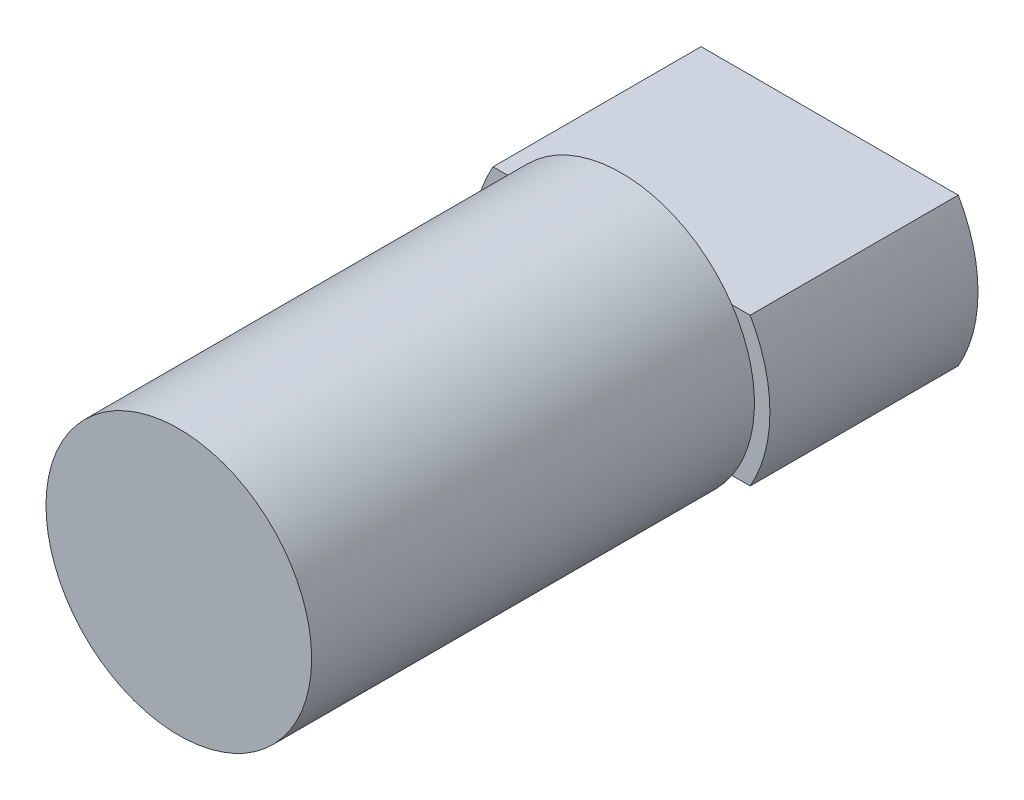
ISO-10303-21;
HEADER;
FILE_DESCRIPTION(('STEP AP214'),'2;1');
FILE_NAME('part.step','',(''),(''),'','','');
FILE_SCHEMA(('AUTOMOTIVE_DESIGN { 1 0 10303 214 1 1 1 1 }'));
ENDSEC;
DATA;
#1=APPLICATION_CONTEXT('core data for automotive mechanical design processes');
#2=APPLICATION_PROTOCOL_DEFINITION('international standard','automotive_design',2000,#1);
#3=PRODUCT_CONTEXT('',#1,'mechanical');
#4=PRODUCT('Part','Part','',(#3));
#5=PRODUCT_RELATED_PRODUCT_CATEGORY('part','',(#4));
#6=PRODUCT_DEFINITION_FORMATION('','',#4);
#7=PRODUCT_DEFINITION_CONTEXT('part definition',#1,'design');
#8=PRODUCT_DEFINITION('design','',#6,#7);
#9=PRODUCT_DEFINITION_SHAPE('','',#8);
#10=(LENGTH_UNIT() NAMED_UNIT(*) SI_UNIT(.MILLI.,.METRE.));
#11=(NAMED_UNIT(*) PLANE_ANGLE_UNIT() SI_UNIT($,.RADIAN.));
#12=(NAMED_UNIT(*) SI_UNIT($,.STERADIAN.) SOLID_ANGLE_UNIT());
#13=UNCERTAINTY_MEASURE_WITH_UNIT(LENGTH_MEASURE(1.E-05),#10,'distance_accuracy_value','');
#14=(GEOMETRIC_REPRESENTATION_CONTEXT(3) GLOBAL_UNCERTAINTY_ASSIGNED_CONTEXT((#13)) GLOBAL_UNIT_ASSIGNED_CONTEXT((#10,
#11,#12)) REPRESENTATION_CONTEXT('',''));
#15=CARTESIAN_POINT('',(0.,0.,0.));
#16=DIRECTION('',(0.,0.,1.));
#17=DIRECTION('',(1.,0.,0.));
#18=AXIS2_PLACEMENT_3D('',#15,#16,#17);
#19=CARTESIAN_POINT('',(0.,0.,0.));
#20=DIRECTION('',(0.,0.,1.));
#21=DIRECTION('',(1.,0.,0.));
#22=AXIS2_PLACEMENT_3D('',#19,#20,#21);
#23=PLANE('',#22);
#24=CARTESIAN_POINT('',(0.,0.,0.));
#25=DIRECTION('',(0.,0.,1.));
#26=DIRECTION('',(1.,0.,0.));
#27=AXIS2_PLACEMENT_3D('',#24,#25,#26);
#28=CIRCLE('',#27,15.);
#29=CARTESIAN_POINT('',(-12.4610392824997,8.35,0.));
#30=VERTEX_POINT('',#29);
#31=CARTESIAN_POINT('',(-12.4610392824997,-8.35,0.));
#32=VERTEX_POINT('',#31);
#33=EDGE_CURVE('E11',#30,#32,#28,.T.);
#34=ORIENTED_EDGE('',*,*,#33,.F.);
#35=DIRECTION('',(1.,0.,0.));
#36=VECTOR('',#35,1.);
#37=CARTESIAN_POINT('',(0.,8.35,0.));
#38=LINE('',#37,#36);
#39=CARTESIAN_POINT('',(-14.5203305747493,8.35,0.));
#40=VERTEX_POINT('',#39);
#41=EDGE_CURVE('E95',#40,#30,#38,.T.);
#42=ORIENTED_EDGE('',*,*,#41,.F.);
#43=CARTESIAN_POINT('',(0.,0.,0.));
#44=DIRECTION('',(0.,0.,1.));
#45=DIRECTION('',(1.,0.,0.));
#46=AXIS2_PLACEMENT_3D('',#43,#44,#45);
#47=CIRCLE('',#46,16.75);
#48=CARTESIAN_POINT('',(-14.5203305747493,-8.35,0.));
#49=VERTEX_POINT('',#48);
#50=EDGE_CURVE('E120',#40,#49,#47,.T.);
#51=ORIENTED_EDGE('',*,*,#50,.T.);
#52=DIRECTION('',(1.,0.,0.));
#53=VECTOR('',#52,1.);
#54=CARTESIAN_POINT('',(0.,-8.35,0.));
#55=LINE('',#54,#53);
#56=EDGE_CURVE('E128',#49,#32,#55,.T.);
#57=ORIENTED_EDGE('',*,*,#56,.T.);
#58=EDGE_LOOP('',(#34,#42,#51,#57));
#59=FACE_BOUND('',#58,.T.);
#60=ADVANCED_FACE('F35',(#59),#23,.T.);
#61=CARTESIAN_POINT('',(0.,-8.35,-23.5));
#62=DIRECTION('',(0.,-1.,0.));
#63=DIRECTION('',(0.,0.,-1.));
#64=AXIS2_PLACEMENT_3D('',#61,#62,#63);
#65=PLANE('',#64);
#66=ORIENTED_EDGE('',*,*,#56,.F.);
#67=DIRECTION('',(0.,0.,1.));
#68=VECTOR('',#67,1.);
#69=CARTESIAN_POINT('',(-14.5203305747493,-8.35,-23.5));
#70=LINE('',#69,#68);
#71=CARTESIAN_POINT('',(-14.5203305747493,-8.35,-23.5));
#72=VERTEX_POINT('',#71);
#73=EDGE_CURVE('E109',#72,#49,#70,.T.);
#74=ORIENTED_EDGE('',*,*,#73,.F.);
#75=DIRECTION('',(1.,0.,0.));
#76=VECTOR('',#75,1.);
#77=CARTESIAN_POINT('',(0.,-8.35,-23.5));
#78=LINE('',#77,#76);
#79=CARTESIAN_POINT('',(14.5203305747493,-8.35,-23.5));
#80=VERTEX_POINT('',#79);
#81=EDGE_CURVE('E116',#72,#80,#78,.T.);
#82=ORIENTED_EDGE('',*,*,#81,.T.);
#83=DIRECTION('',(0.,0.,1.));
#84=VECTOR('',#83,1.);
#85=CARTESIAN_POINT('',(14.5203305747493,-8.35,-23.5));
#86=LINE('',#85,#84);
#87=CARTESIAN_POINT('',(14.5203305747493,-8.35,0.));
#88=VERTEX_POINT('',#87);
#89=EDGE_CURVE('E39',#80,#88,#86,.T.);
#90=ORIENTED_EDGE('',*,*,#89,.T.);
#91=CARTESIAN_POINT('',(12.4610392824997,-8.35,0.));
#92=VERTEX_POINT('',#91);
#93=EDGE_CURVE('E113',#92,#88,#55,.T.);
#94=ORIENTED_EDGE('',*,*,#93,.F.);
#95=EDGE_CURVE('E130',#32,#92,#55,.T.);
#96=ORIENTED_EDGE('',*,*,#95,.F.);
#97=EDGE_LOOP('',(#66,#74,#82,#90,#94,#96));
#98=FACE_BOUND('',#97,.T.);
#99=ADVANCED_FACE('F37',(#98),#65,.T.);
#100=CARTESIAN_POINT('',(0.,0.,-23.5));
#101=DIRECTION('',(0.,0.,1.));
#102=DIRECTION('',(1.,0.,0.));
#103=AXIS2_PLACEMENT_3D('',#100,#101,#102);
#104=CYLINDRICAL_SURFACE('',#103,16.75);
#105=ORIENTED_EDGE('',*,*,#50,.F.);
#106=DIRECTION('',(0.,0.,1.));
#107=VECTOR('',#106,1.);
#108=CARTESIAN_POINT('',(-14.5203305747493,8.35,-23.5));
#109=LINE('',#108,#107);
#110=CARTESIAN_POINT('',(-14.5203305747493,8.35,-23.5));
#111=VERTEX_POINT('',#110);
#112=EDGE_CURVE('E135',#111,#40,#109,.T.);
#113=ORIENTED_EDGE('',*,*,#112,.F.);
#114=CARTESIAN_POINT('',(0.,0.,-23.5));
#115=DIRECTION('',(0.,0.,1.));
#116=DIRECTION('',(1.,0.,0.));
#117=AXIS2_PLACEMENT_3D('',#114,#115,#116);
#118=CIRCLE('',#117,16.75);
#119=EDGE_CURVE('E125',#111,#72,#118,.T.);
#120=ORIENTED_EDGE('',*,*,#119,.T.);
#121=ORIENTED_EDGE('',*,*,#73,.T.);
#122=EDGE_LOOP('',(#105,#113,#120,#121));
#123=FACE_BOUND('',#122,.T.);
#124=ADVANCED_FACE('F153',(#123),#104,.T.);
#125=CARTESIAN_POINT('',(0.,8.35,-23.5));
#126=DIRECTION('',(0.,-1.,0.));
#127=DIRECTION('',(0.,0.,-1.));
#128=AXIS2_PLACEMENT_3D('',#125,#126,#127);
#129=PLANE('',#128);
#130=ORIENTED_EDGE('',*,*,#41,.T.);
#131=CARTESIAN_POINT('',(12.4610392824997,8.35,0.));
#132=VERTEX_POINT('',#131);
#133=EDGE_CURVE('E90',#30,#132,#38,.T.);
#134=ORIENTED_EDGE('',*,*,#133,.T.);
#135=CARTESIAN_POINT('',(14.5203305747493,8.35,0.));
#136=VERTEX_POINT('',#135);
#137=EDGE_CURVE('E93',#132,#136,#38,.T.);
#138=ORIENTED_EDGE('',*,*,#137,.T.);
#139=DIRECTION('',(0.,0.,1.));
#140=VECTOR('',#139,1.);
#141=CARTESIAN_POINT('',(14.5203305747493,8.35,-23.5));
#142=LINE('',#141,#140);
#143=CARTESIAN_POINT('',(14.5203305747493,8.35,-23.5));
#144=VERTEX_POINT('',#143);
#145=EDGE_CURVE('E136',#144,#136,#142,.T.);
#146=ORIENTED_EDGE('',*,*,#145,.F.);
#147=DIRECTION('',(1.,0.,0.));
#148=VECTOR('',#147,1.);
#149=CARTESIAN_POINT('',(0.,8.35,-23.5));
#150=LINE('',#149,#148);
#151=EDGE_CURVE('E123',#111,#144,#150,.T.);
#152=ORIENTED_EDGE('',*,*,#151,.F.);
#153=ORIENTED_EDGE('',*,*,#112,.T.);
#154=EDGE_LOOP('',(#130,#134,#138,#146,#152,#153));
#155=FACE_BOUND('',#154,.T.);
#156=ADVANCED_FACE('F91',(#155),#129,.F.);
#157=CARTESIAN_POINT('',(0.,0.,-23.5));
#158=DIRECTION('',(0.,0.,1.));
#159=DIRECTION('',(1.,0.,0.));
#160=AXIS2_PLACEMENT_3D('',#157,#158,#159);
#161=CYLINDRICAL_SURFACE('',#160,16.75);
#162=CARTESIAN_POINT('',(0.,0.,0.));
#163=DIRECTION('',(0.,0.,1.));
#164=DIRECTION('',(1.,0.,0.));
#165=AXIS2_PLACEMENT_3D('',#162,#163,#164);
#166=CIRCLE('',#165,16.75);
#167=EDGE_CURVE('E103',#88,#136,#166,.T.);
#168=ORIENTED_EDGE('',*,*,#167,.F.);
#169=ORIENTED_EDGE('',*,*,#89,.F.);
#170=CARTESIAN_POINT('',(0.,0.,-23.5));
#171=DIRECTION('',(0.,0.,1.));
#172=DIRECTION('',(1.,0.,0.));
#173=AXIS2_PLACEMENT_3D('',#170,#171,#172);
#174=CIRCLE('',#173,16.75);
#175=EDGE_CURVE('E119',#80,#144,#174,.T.);
#176=ORIENTED_EDGE('',*,*,#175,.T.);
#177=ORIENTED_EDGE('',*,*,#145,.T.);
#178=EDGE_LOOP('',(#168,#169,#176,#177));
#179=FACE_BOUND('',#178,.T.);
#180=ADVANCED_FACE('F144',(#179),#161,.T.);
#181=CARTESIAN_POINT('',(0.,0.,-23.5));
#182=DIRECTION('',(0.,0.,1.));
#183=DIRECTION('',(1.,0.,0.));
#184=AXIS2_PLACEMENT_3D('',#181,#182,#183);
#185=PLANE('',#184);
#186=ORIENTED_EDGE('',*,*,#81,.F.);
#187=ORIENTED_EDGE('',*,*,#119,.F.);
#188=ORIENTED_EDGE('',*,*,#151,.T.);
#189=ORIENTED_EDGE('',*,*,#175,.F.);
#190=EDGE_LOOP('',(#186,#187,#188,#189));
#191=FACE_BOUND('',#190,.T.);
#192=ADVANCED_FACE('F146',(#191),#185,.F.);
#193=EDGE_CURVE('E44',#92,#132,#28,.T.);
#194=ORIENTED_EDGE('',*,*,#193,.F.);
#195=ORIENTED_EDGE('',*,*,#93,.T.);
#196=ORIENTED_EDGE('',*,*,#167,.T.);
#197=ORIENTED_EDGE('',*,*,#137,.F.);
#198=EDGE_LOOP('',(#194,#195,#196,#197));
#199=FACE_BOUND('',#198,.T.);
#200=ADVANCED_FACE('F101',(#199),#23,.T.);
#201=CARTESIAN_POINT('',(0.,0.,0.));
#202=DIRECTION('',(0.,0.,1.));
#203=DIRECTION('',(1.,0.,0.));
#204=AXIS2_PLACEMENT_3D('',#201,#202,#203);
#205=PLANE('',#204);
#206=EDGE_CURVE('E46',#32,#92,#28,.T.);
#207=ORIENTED_EDGE('',*,*,#206,.F.);
#208=ORIENTED_EDGE('',*,*,#95,.T.);
#209=EDGE_LOOP('',(#207,#208));
#210=FACE_BOUND('',#209,.T.);
#211=ADVANCED_FACE('F162',(#210),#205,.F.);
#212=CARTESIAN_POINT('',(0.,0.,50.));
#213=DIRECTION('',(0.,0.,-1.));
#214=DIRECTION('',(-1.,0.,0.));
#215=AXIS2_PLACEMENT_3D('',#212,#213,#214);
#216=CYLINDRICAL_SURFACE('',#215,15.);
#217=CARTESIAN_POINT('',(0.,0.,50.));
#218=DIRECTION('',(0.,0.,1.));
#219=DIRECTION('',(1.,0.,0.));
#220=AXIS2_PLACEMENT_3D('',#217,#218,#219);
#221=CIRCLE('',#220,15.);
#222=CARTESIAN_POINT('',(15.,0.,50.));
#223=VERTEX_POINT('',#222);
#224=EDGE_CURVE('E111',#223,#223,#221,.T.);
#225=ORIENTED_EDGE('',*,*,#224,.F.);
#226=EDGE_LOOP('',(#225));
#227=FACE_BOUND('',#226,.T.);
#228=EDGE_CURVE('E107',#132,#30,#28,.T.);
#229=ORIENTED_EDGE('',*,*,#228,.T.);
#230=ORIENTED_EDGE('',*,*,#33,.T.);
#231=ORIENTED_EDGE('',*,*,#206,.T.);
#232=ORIENTED_EDGE('',*,*,#193,.T.);
#233=EDGE_LOOP('',(#229,#230,#231,#232));
#234=FACE_BOUND('',#233,.T.);
#235=ADVANCED_FACE('F106',(#227,#234),#216,.T.);
#236=CARTESIAN_POINT('',(0.,0.,50.));
#237=DIRECTION('',(0.,0.,1.));
#238=DIRECTION('',(1.,0.,0.));
#239=AXIS2_PLACEMENT_3D('',#236,#237,#238);
#240=PLANE('',#239);
#241=ORIENTED_EDGE('',*,*,#224,.T.);
#242=EDGE_LOOP('',(#241));
#243=FACE_BOUND('',#242,.T.);
#244=ADVANCED_FACE('F171',(#243),#240,.T.);
#245=ORIENTED_EDGE('',*,*,#133,.F.);
#246=ORIENTED_EDGE('',*,*,#228,.F.);
#247=EDGE_LOOP('',(#245,#246));
#248=FACE_BOUND('',#247,.T.);
#249=ADVANCED_FACE('F110',(#248),#205,.F.);
#250=CLOSED_SHELL('',(#60,#99,#124,#156,#180,#192,#200,#211,#235,#244,#249));
#251=MANIFOLD_SOLID_BREP('B2',#250);
#252=ADVANCED_BREP_SHAPE_REPRESENTATION('',(#18,#251),#14);
#253=SHAPE_DEFINITION_REPRESENTATION(#9,#252);
ENDSEC;
END-ISO-10303-21;
